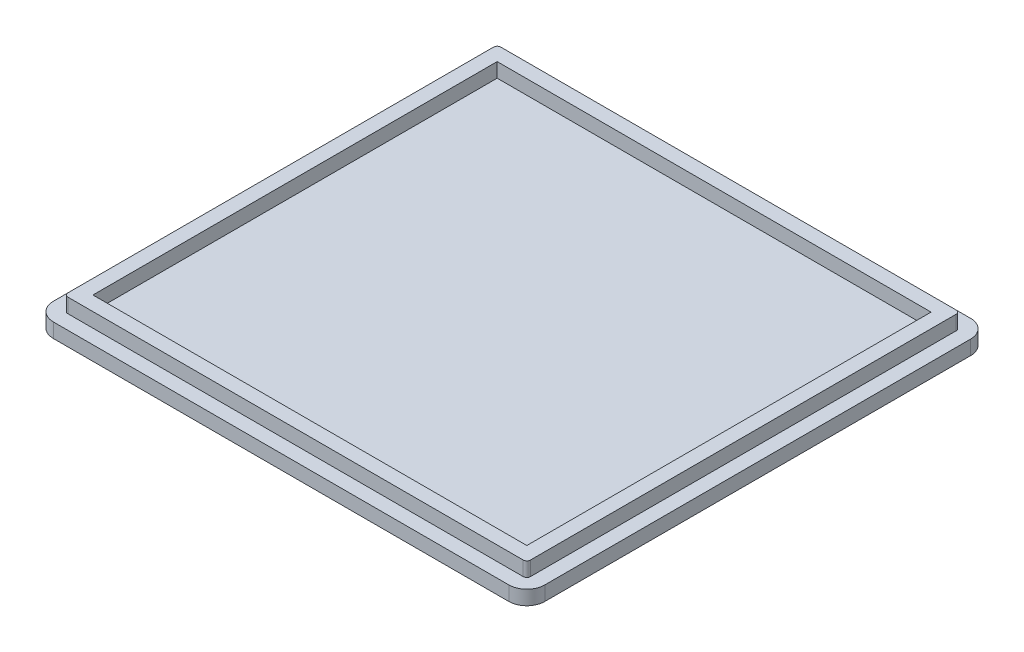
ISO-10303-21;
HEADER;
FILE_DESCRIPTION(('STEP AP214'),'2;1');
FILE_NAME('part.step','',(''),(''),'','','');
FILE_SCHEMA(('AUTOMOTIVE_DESIGN { 1 0 10303 214 1 1 1 1 }'));
ENDSEC;
DATA;
#1=APPLICATION_CONTEXT('core data for automotive mechanical design processes');
#2=APPLICATION_PROTOCOL_DEFINITION('international standard','automotive_design',2000,#1);
#3=PRODUCT_CONTEXT('',#1,'mechanical');
#4=PRODUCT('Part','Part','',(#3));
#5=PRODUCT_RELATED_PRODUCT_CATEGORY('part','',(#4));
#6=PRODUCT_DEFINITION_FORMATION('','',#4);
#7=PRODUCT_DEFINITION_CONTEXT('part definition',#1,'design');
#8=PRODUCT_DEFINITION('design','',#6,#7);
#9=PRODUCT_DEFINITION_SHAPE('','',#8);
#10=(LENGTH_UNIT() NAMED_UNIT(*) SI_UNIT(.MILLI.,.METRE.));
#11=(NAMED_UNIT(*) PLANE_ANGLE_UNIT() SI_UNIT($,.RADIAN.));
#12=(NAMED_UNIT(*) SI_UNIT($,.STERADIAN.) SOLID_ANGLE_UNIT());
#13=UNCERTAINTY_MEASURE_WITH_UNIT(LENGTH_MEASURE(1.E-05),#10,'distance_accuracy_value','');
#14=(GEOMETRIC_REPRESENTATION_CONTEXT(3) GLOBAL_UNCERTAINTY_ASSIGNED_CONTEXT((#13)) GLOBAL_UNIT_ASSIGNED_CONTEXT((#10,
#11,#12)) REPRESENTATION_CONTEXT('',''));
#15=CARTESIAN_POINT('',(0.,0.,0.));
#16=DIRECTION('',(0.,0.,1.));
#17=DIRECTION('',(1.,0.,0.));
#18=AXIS2_PLACEMENT_3D('',#15,#16,#17);
#19=CARTESIAN_POINT('',(0.,1.6,0.));
#20=DIRECTION('',(0.,1.,0.));
#21=DIRECTION('',(0.,0.,1.));
#22=AXIS2_PLACEMENT_3D('',#19,#20,#21);
#23=PLANE('',#22);
#24=DIRECTION('',(0.,0.,1.));
#25=VECTOR('',#24,1.);
#26=CARTESIAN_POINT('',(-25.75,1.6,0.));
#27=LINE('',#26,#25);
#28=CARTESIAN_POINT('',(-25.75,1.6,-23.7));
#29=VERTEX_POINT('',#28);
#30=CARTESIAN_POINT('',(-25.75,1.6,23.7));
#31=VERTEX_POINT('',#30);
#32=EDGE_CURVE('E234',#29,#31,#27,.T.);
#33=ORIENTED_EDGE('',*,*,#32,.F.);
#34=CARTESIAN_POINT('',(-25.35,1.6,-23.7));
#35=DIRECTION('',(0.,1.,0.));
#36=DIRECTION('',(0.,0.,1.));
#37=AXIS2_PLACEMENT_3D('',#34,#35,#36);
#38=CIRCLE('',#37,0.4);
#39=CARTESIAN_POINT('',(-25.35,1.6,-24.1));
#40=VERTEX_POINT('',#39);
#41=EDGE_CURVE('E11',#29,#40,#38,.F.);
#42=ORIENTED_EDGE('',*,*,#41,.T.);
#43=DIRECTION('',(-1.,0.,0.));
#44=VECTOR('',#43,1.);
#45=CARTESIAN_POINT('',(0.,1.6,-24.1));
#46=LINE('',#45,#44);
#47=CARTESIAN_POINT('',(25.35,1.6,-24.1));
#48=VERTEX_POINT('',#47);
#49=EDGE_CURVE('E223',#48,#40,#46,.T.);
#50=ORIENTED_EDGE('',*,*,#49,.F.);
#51=CARTESIAN_POINT('',(25.35,1.6,-23.7));
#52=DIRECTION('',(0.,1.,0.));
#53=DIRECTION('',(0.,0.,1.));
#54=AXIS2_PLACEMENT_3D('',#51,#52,#53);
#55=CIRCLE('',#54,0.4);
#56=CARTESIAN_POINT('',(25.75,1.6,-23.7));
#57=VERTEX_POINT('',#56);
#58=EDGE_CURVE('E369',#48,#57,#55,.F.);
#59=ORIENTED_EDGE('',*,*,#58,.T.);
#60=DIRECTION('',(0.,0.,1.));
#61=VECTOR('',#60,1.);
#62=CARTESIAN_POINT('',(25.75,1.6,0.));
#63=LINE('',#62,#61);
#64=CARTESIAN_POINT('',(25.75,1.6,23.7));
#65=VERTEX_POINT('',#64);
#66=EDGE_CURVE('E227',#57,#65,#63,.T.);
#67=ORIENTED_EDGE('',*,*,#66,.T.);
#68=CARTESIAN_POINT('',(25.35,1.6,23.7));
#69=DIRECTION('',(0.,1.,0.));
#70=DIRECTION('',(0.,0.,1.));
#71=AXIS2_PLACEMENT_3D('',#68,#69,#70);
#72=CIRCLE('',#71,0.4);
#73=CARTESIAN_POINT('',(25.35,1.6,24.1));
#74=VERTEX_POINT('',#73);
#75=EDGE_CURVE('E372',#65,#74,#72,.F.);
#76=ORIENTED_EDGE('',*,*,#75,.T.);
#77=DIRECTION('',(-1.,0.,0.));
#78=VECTOR('',#77,1.);
#79=CARTESIAN_POINT('',(0.,1.6,24.1));
#80=LINE('',#79,#78);
#81=CARTESIAN_POINT('',(-25.35,1.6,24.1));
#82=VERTEX_POINT('',#81);
#83=EDGE_CURVE('E231',#74,#82,#80,.T.);
#84=ORIENTED_EDGE('',*,*,#83,.T.);
#85=CARTESIAN_POINT('',(-25.35,1.6,23.7));
#86=DIRECTION('',(0.,1.,0.));
#87=DIRECTION('',(0.,0.,1.));
#88=AXIS2_PLACEMENT_3D('',#85,#86,#87);
#89=CIRCLE('',#88,0.4);
#90=EDGE_CURVE('E48',#82,#31,#89,.F.);
#91=ORIENTED_EDGE('',*,*,#90,.T.);
#92=EDGE_LOOP('',(#33,#42,#50,#59,#67,#76,#84,#91));
#93=FACE_BOUND('',#92,.T.);
#94=DIRECTION('',(0.,0.,-1.));
#95=VECTOR('',#94,1.);
#96=CARTESIAN_POINT('',(-27.35,1.6,0.));
#97=LINE('',#96,#95);
#98=CARTESIAN_POINT('',(-27.35,1.6,23.7));
#99=VERTEX_POINT('',#98);
#100=CARTESIAN_POINT('',(-27.35,1.6,-23.7));
#101=VERTEX_POINT('',#100);
#102=EDGE_CURVE('E260',#99,#101,#97,.T.);
#103=ORIENTED_EDGE('',*,*,#102,.F.);
#104=CARTESIAN_POINT('',(-25.35,1.6,23.7));
#105=DIRECTION('',(0.,1.,0.));
#106=DIRECTION('',(0.,0.,1.));
#107=AXIS2_PLACEMENT_3D('',#104,#105,#106);
#108=CIRCLE('',#107,2.);
#109=CARTESIAN_POINT('',(-25.35,1.6,25.7));
#110=VERTEX_POINT('',#109);
#111=EDGE_CURVE('E313',#99,#110,#108,.T.);
#112=ORIENTED_EDGE('',*,*,#111,.T.);
#113=DIRECTION('',(1.,0.,0.));
#114=VECTOR('',#113,1.);
#115=CARTESIAN_POINT('',(0.,1.6,25.7));
#116=LINE('',#115,#114);
#117=CARTESIAN_POINT('',(25.35,1.6,25.7));
#118=VERTEX_POINT('',#117);
#119=EDGE_CURVE('E247',#110,#118,#116,.T.);
#120=ORIENTED_EDGE('',*,*,#119,.T.);
#121=CARTESIAN_POINT('',(25.35,1.6,23.7));
#122=DIRECTION('',(0.,1.,0.));
#123=DIRECTION('',(0.,0.,1.));
#124=AXIS2_PLACEMENT_3D('',#121,#122,#123);
#125=CIRCLE('',#124,2.);
#126=CARTESIAN_POINT('',(27.35,1.6,23.7));
#127=VERTEX_POINT('',#126);
#128=EDGE_CURVE('E310',#118,#127,#125,.T.);
#129=ORIENTED_EDGE('',*,*,#128,.T.);
#130=DIRECTION('',(0.,0.,-1.));
#131=VECTOR('',#130,1.);
#132=CARTESIAN_POINT('',(27.35,1.6,0.));
#133=LINE('',#132,#131);
#134=CARTESIAN_POINT('',(27.35,1.6,-23.7));
#135=VERTEX_POINT('',#134);
#136=EDGE_CURVE('E251',#127,#135,#133,.T.);
#137=ORIENTED_EDGE('',*,*,#136,.T.);
#138=CARTESIAN_POINT('',(25.35,1.6,-23.7));
#139=DIRECTION('',(0.,1.,0.));
#140=DIRECTION('',(0.,0.,1.));
#141=AXIS2_PLACEMENT_3D('',#138,#139,#140);
#142=CIRCLE('',#141,2.);
#143=CARTESIAN_POINT('',(25.35,1.6,-25.7));
#144=VERTEX_POINT('',#143);
#145=EDGE_CURVE('E304',#135,#144,#142,.T.);
#146=ORIENTED_EDGE('',*,*,#145,.T.);
#147=DIRECTION('',(1.,0.,0.));
#148=VECTOR('',#147,1.);
#149=CARTESIAN_POINT('',(0.,1.6,-25.7));
#150=LINE('',#149,#148);
#151=CARTESIAN_POINT('',(-25.35,1.6,-25.7));
#152=VERTEX_POINT('',#151);
#153=EDGE_CURVE('E256',#152,#144,#150,.T.);
#154=ORIENTED_EDGE('',*,*,#153,.F.);
#155=CARTESIAN_POINT('',(-25.35,1.6,-23.7));
#156=DIRECTION('',(0.,1.,0.));
#157=DIRECTION('',(0.,0.,1.));
#158=AXIS2_PLACEMENT_3D('',#155,#156,#157);
#159=CIRCLE('',#158,2.);
#160=EDGE_CURVE('E307',#152,#101,#159,.T.);
#161=ORIENTED_EDGE('',*,*,#160,.T.);
#162=EDGE_LOOP('',(#103,#112,#120,#129,#137,#146,#154,#161));
#163=FACE_BOUND('',#162,.T.);
#164=ADVANCED_FACE('F39',(#93,#163),#23,.T.);
#165=CARTESIAN_POINT('',(0.,1.6,25.7));
#166=DIRECTION('',(0.,0.,-1.));
#167=DIRECTION('',(-1.,0.,0.));
#168=AXIS2_PLACEMENT_3D('',#165,#166,#167);
#169=PLANE('',#168);
#170=ORIENTED_EDGE('',*,*,#119,.F.);
#171=DIRECTION('',(0.,-1.,0.));
#172=VECTOR('',#171,1.);
#173=CARTESIAN_POINT('',(-25.35,0.,25.7));
#174=LINE('',#173,#172);
#175=CARTESIAN_POINT('',(-25.35,0.,25.7));
#176=VERTEX_POINT('',#175);
#177=EDGE_CURVE('E281',#110,#176,#174,.T.);
#178=ORIENTED_EDGE('',*,*,#177,.T.);
#179=DIRECTION('',(1.,0.,0.));
#180=VECTOR('',#179,1.);
#181=CARTESIAN_POINT('',(0.,0.,25.7));
#182=LINE('',#181,#180);
#183=CARTESIAN_POINT('',(25.35,0.,25.7));
#184=VERTEX_POINT('',#183);
#185=EDGE_CURVE('E246',#176,#184,#182,.T.);
#186=ORIENTED_EDGE('',*,*,#185,.T.);
#187=DIRECTION('',(0.,-1.,0.));
#188=VECTOR('',#187,1.);
#189=CARTESIAN_POINT('',(25.35,1.6,25.7));
#190=LINE('',#189,#188);
#191=EDGE_CURVE('E264',#184,#118,#190,.F.);
#192=ORIENTED_EDGE('',*,*,#191,.T.);
#193=EDGE_LOOP('',(#170,#178,#186,#192));
#194=FACE_BOUND('',#193,.T.);
#195=ADVANCED_FACE('F429',(#194),#169,.F.);
#196=CARTESIAN_POINT('',(27.35,1.6,0.));
#197=DIRECTION('',(-1.,0.,0.));
#198=DIRECTION('',(0.,0.,1.));
#199=AXIS2_PLACEMENT_3D('',#196,#197,#198);
#200=PLANE('',#199);
#201=ORIENTED_EDGE('',*,*,#136,.F.);
#202=DIRECTION('',(0.,-1.,0.));
#203=VECTOR('',#202,1.);
#204=CARTESIAN_POINT('',(27.35,1.6,23.7));
#205=LINE('',#204,#203);
#206=CARTESIAN_POINT('',(27.35,0.,23.7));
#207=VERTEX_POINT('',#206);
#208=EDGE_CURVE('E319',#127,#207,#205,.T.);
#209=ORIENTED_EDGE('',*,*,#208,.T.);
#210=DIRECTION('',(0.,0.,-1.));
#211=VECTOR('',#210,1.);
#212=CARTESIAN_POINT('',(27.35,0.,0.));
#213=LINE('',#212,#211);
#214=CARTESIAN_POINT('',(27.35,0.,-23.7));
#215=VERTEX_POINT('',#214);
#216=EDGE_CURVE('E268',#207,#215,#213,.T.);
#217=ORIENTED_EDGE('',*,*,#216,.T.);
#218=DIRECTION('',(0.,-1.,0.));
#219=VECTOR('',#218,1.);
#220=CARTESIAN_POINT('',(27.35,1.6,-23.7));
#221=LINE('',#220,#219);
#222=EDGE_CURVE('E316',#215,#135,#221,.F.);
#223=ORIENTED_EDGE('',*,*,#222,.T.);
#224=EDGE_LOOP('',(#201,#209,#217,#223));
#225=FACE_BOUND('',#224,.T.);
#226=ADVANCED_FACE('F435',(#225),#200,.F.);
#227=CARTESIAN_POINT('',(0.,1.6,-25.7));
#228=DIRECTION('',(0.,0.,-1.));
#229=DIRECTION('',(-1.,0.,0.));
#230=AXIS2_PLACEMENT_3D('',#227,#228,#229);
#231=PLANE('',#230);
#232=DIRECTION('',(1.,0.,0.));
#233=VECTOR('',#232,1.);
#234=CARTESIAN_POINT('',(0.,0.,-25.7));
#235=LINE('',#234,#233);
#236=CARTESIAN_POINT('',(-25.35,0.,-25.7));
#237=VERTEX_POINT('',#236);
#238=CARTESIAN_POINT('',(25.35,0.,-25.7));
#239=VERTEX_POINT('',#238);
#240=EDGE_CURVE('E272',#237,#239,#235,.T.);
#241=ORIENTED_EDGE('',*,*,#240,.F.);
#242=DIRECTION('',(0.,-1.,0.));
#243=VECTOR('',#242,1.);
#244=CARTESIAN_POINT('',(-25.35,1.6,-25.7));
#245=LINE('',#244,#243);
#246=EDGE_CURVE('E327',#237,#152,#245,.F.);
#247=ORIENTED_EDGE('',*,*,#246,.T.);
#248=ORIENTED_EDGE('',*,*,#153,.T.);
#249=DIRECTION('',(0.,-1.,0.));
#250=VECTOR('',#249,1.);
#251=CARTESIAN_POINT('',(25.35,0.,-25.7));
#252=LINE('',#251,#250);
#253=EDGE_CURVE('E323',#144,#239,#252,.T.);
#254=ORIENTED_EDGE('',*,*,#253,.T.);
#255=EDGE_LOOP('',(#241,#247,#248,#254));
#256=FACE_BOUND('',#255,.T.);
#257=ADVANCED_FACE('F571',(#256),#231,.T.);
#258=CARTESIAN_POINT('',(-27.35,1.6,0.));
#259=DIRECTION('',(-1.,0.,0.));
#260=DIRECTION('',(0.,0.,1.));
#261=AXIS2_PLACEMENT_3D('',#258,#259,#260);
#262=PLANE('',#261);
#263=DIRECTION('',(0.,0.,-1.));
#264=VECTOR('',#263,1.);
#265=CARTESIAN_POINT('',(-27.35,0.,0.));
#266=LINE('',#265,#264);
#267=CARTESIAN_POINT('',(-27.35,0.,23.7));
#268=VERTEX_POINT('',#267);
#269=CARTESIAN_POINT('',(-27.35,0.,-23.7));
#270=VERTEX_POINT('',#269);
#271=EDGE_CURVE('E252',#268,#270,#266,.T.);
#272=ORIENTED_EDGE('',*,*,#271,.F.);
#273=DIRECTION('',(0.,-1.,0.));
#274=VECTOR('',#273,1.);
#275=CARTESIAN_POINT('',(-27.35,1.6,23.7));
#276=LINE('',#275,#274);
#277=EDGE_CURVE('E301',#268,#99,#276,.F.);
#278=ORIENTED_EDGE('',*,*,#277,.T.);
#279=ORIENTED_EDGE('',*,*,#102,.T.);
#280=DIRECTION('',(0.,-1.,0.));
#281=VECTOR('',#280,1.);
#282=CARTESIAN_POINT('',(-27.35,1.6,-23.7));
#283=LINE('',#282,#281);
#284=EDGE_CURVE('E297',#101,#270,#283,.T.);
#285=ORIENTED_EDGE('',*,*,#284,.T.);
#286=EDGE_LOOP('',(#272,#278,#279,#285));
#287=FACE_BOUND('',#286,.T.);
#288=ADVANCED_FACE('F560',(#287),#262,.T.);
#289=CARTESIAN_POINT('',(0.,0.,0.));
#290=DIRECTION('',(0.,1.,0.));
#291=DIRECTION('',(0.,0.,1.));
#292=AXIS2_PLACEMENT_3D('',#289,#290,#291);
#293=PLANE('',#292);
#294=ORIENTED_EDGE('',*,*,#185,.F.);
#295=CARTESIAN_POINT('',(-25.35,0.,23.7));
#296=DIRECTION('',(0.,1.,0.));
#297=DIRECTION('',(0.,0.,1.));
#298=AXIS2_PLACEMENT_3D('',#295,#296,#297);
#299=CIRCLE('',#298,2.);
#300=EDGE_CURVE('E294',#176,#268,#299,.F.);
#301=ORIENTED_EDGE('',*,*,#300,.T.);
#302=ORIENTED_EDGE('',*,*,#271,.T.);
#303=CARTESIAN_POINT('',(-25.35,0.,-23.7));
#304=DIRECTION('',(0.,1.,0.));
#305=DIRECTION('',(0.,0.,1.));
#306=AXIS2_PLACEMENT_3D('',#303,#304,#305);
#307=CIRCLE('',#306,2.);
#308=EDGE_CURVE('E288',#270,#237,#307,.F.);
#309=ORIENTED_EDGE('',*,*,#308,.T.);
#310=ORIENTED_EDGE('',*,*,#240,.T.);
#311=CARTESIAN_POINT('',(25.35,0.,-23.7));
#312=DIRECTION('',(0.,1.,0.));
#313=DIRECTION('',(0.,0.,1.));
#314=AXIS2_PLACEMENT_3D('',#311,#312,#313);
#315=CIRCLE('',#314,2.);
#316=EDGE_CURVE('E285',#239,#215,#315,.F.);
#317=ORIENTED_EDGE('',*,*,#316,.T.);
#318=ORIENTED_EDGE('',*,*,#216,.F.);
#319=CARTESIAN_POINT('',(25.35,0.,23.7));
#320=DIRECTION('',(0.,1.,0.));
#321=DIRECTION('',(0.,0.,1.));
#322=AXIS2_PLACEMENT_3D('',#319,#320,#321);
#323=CIRCLE('',#322,2.);
#324=EDGE_CURVE('E291',#207,#184,#323,.F.);
#325=ORIENTED_EDGE('',*,*,#324,.T.);
#326=EDGE_LOOP('',(#294,#301,#302,#309,#310,#317,#318,#325));
#327=FACE_BOUND('',#326,.T.);
#328=ADVANCED_FACE('F469',(#327),#293,.F.);
#329=CARTESIAN_POINT('',(24.15,3.2,0.));
#330=DIRECTION('',(-1.,0.,0.));
#331=DIRECTION('',(0.,0.,1.));
#332=AXIS2_PLACEMENT_3D('',#329,#330,#331);
#333=PLANE('',#332);
#334=DIRECTION('',(0.,-1.,0.));
#335=VECTOR('',#334,1.);
#336=CARTESIAN_POINT('',(24.15,3.2,-22.5));
#337=LINE('',#336,#335);
#338=CARTESIAN_POINT('',(24.15,3.2,-22.5));
#339=VERTEX_POINT('',#338);
#340=CARTESIAN_POINT('',(24.15,1.6,-22.5));
#341=VERTEX_POINT('',#340);
#342=EDGE_CURVE('E212',#339,#341,#337,.T.);
#343=ORIENTED_EDGE('',*,*,#342,.T.);
#344=DIRECTION('',(0.,0.,1.));
#345=VECTOR('',#344,1.);
#346=CARTESIAN_POINT('',(24.15,1.6,0.));
#347=LINE('',#346,#345);
#348=CARTESIAN_POINT('',(24.15,1.6,22.5));
#349=VERTEX_POINT('',#348);
#350=EDGE_CURVE('E182',#341,#349,#347,.T.);
#351=ORIENTED_EDGE('',*,*,#350,.T.);
#352=DIRECTION('',(0.,-1.,0.));
#353=VECTOR('',#352,1.);
#354=CARTESIAN_POINT('',(24.15,3.2,22.5));
#355=LINE('',#354,#353);
#356=CARTESIAN_POINT('',(24.15,3.2,22.5));
#357=VERTEX_POINT('',#356);
#358=EDGE_CURVE('E176',#357,#349,#355,.T.);
#359=ORIENTED_EDGE('',*,*,#358,.F.);
#360=DIRECTION('',(0.,0.,-1.));
#361=VECTOR('',#360,1.);
#362=CARTESIAN_POINT('',(24.15,3.2,0.));
#363=LINE('',#362,#361);
#364=EDGE_CURVE('E180',#357,#339,#363,.T.);
#365=ORIENTED_EDGE('',*,*,#364,.T.);
#366=EDGE_LOOP('',(#343,#351,#359,#365));
#367=FACE_BOUND('',#366,.T.);
#368=ADVANCED_FACE('F179',(#367),#333,.T.);
#369=CARTESIAN_POINT('',(0.,3.2,22.5));
#370=DIRECTION('',(0.,0.,-1.));
#371=DIRECTION('',(-1.,0.,0.));
#372=AXIS2_PLACEMENT_3D('',#369,#370,#371);
#373=PLANE('',#372);
#374=ORIENTED_EDGE('',*,*,#358,.T.);
#375=DIRECTION('',(-1.,0.,0.));
#376=VECTOR('',#375,1.);
#377=CARTESIAN_POINT('',(0.,1.6,22.5));
#378=LINE('',#377,#376);
#379=CARTESIAN_POINT('',(-24.15,1.6,22.5));
#380=VERTEX_POINT('',#379);
#381=EDGE_CURVE('E241',#349,#380,#378,.T.);
#382=ORIENTED_EDGE('',*,*,#381,.T.);
#383=DIRECTION('',(0.,-1.,0.));
#384=VECTOR('',#383,1.);
#385=CARTESIAN_POINT('',(-24.15,3.2,22.5));
#386=LINE('',#385,#384);
#387=CARTESIAN_POINT('',(-24.15,3.2,22.5));
#388=VERTEX_POINT('',#387);
#389=EDGE_CURVE('E188',#388,#380,#386,.T.);
#390=ORIENTED_EDGE('',*,*,#389,.F.);
#391=DIRECTION('',(1.,0.,0.));
#392=VECTOR('',#391,1.);
#393=CARTESIAN_POINT('',(0.,3.2,22.5));
#394=LINE('',#393,#392);
#395=EDGE_CURVE('E194',#388,#357,#394,.T.);
#396=ORIENTED_EDGE('',*,*,#395,.T.);
#397=EDGE_LOOP('',(#374,#382,#390,#396));
#398=FACE_BOUND('',#397,.T.);
#399=ADVANCED_FACE('F200',(#398),#373,.T.);
#400=CARTESIAN_POINT('',(-24.15,3.2,0.));
#401=DIRECTION('',(-1.,0.,0.));
#402=DIRECTION('',(0.,0.,1.));
#403=AXIS2_PLACEMENT_3D('',#400,#401,#402);
#404=PLANE('',#403);
#405=DIRECTION('',(0.,0.,1.));
#406=VECTOR('',#405,1.);
#407=CARTESIAN_POINT('',(-24.15,1.6,0.));
#408=LINE('',#407,#406);
#409=CARTESIAN_POINT('',(-24.15,1.6,-22.5));
#410=VERTEX_POINT('',#409);
#411=EDGE_CURVE('E237',#410,#380,#408,.T.);
#412=ORIENTED_EDGE('',*,*,#411,.F.);
#413=DIRECTION('',(0.,-1.,0.));
#414=VECTOR('',#413,1.);
#415=CARTESIAN_POINT('',(-24.15,3.2,-22.5));
#416=LINE('',#415,#414);
#417=CARTESIAN_POINT('',(-24.15,3.2,-22.5));
#418=VERTEX_POINT('',#417);
#419=EDGE_CURVE('E215',#418,#410,#416,.T.);
#420=ORIENTED_EDGE('',*,*,#419,.F.);
#421=DIRECTION('',(0.,0.,-1.));
#422=VECTOR('',#421,1.);
#423=CARTESIAN_POINT('',(-24.15,3.2,0.));
#424=LINE('',#423,#422);
#425=EDGE_CURVE('E204',#388,#418,#424,.T.);
#426=ORIENTED_EDGE('',*,*,#425,.F.);
#427=ORIENTED_EDGE('',*,*,#389,.T.);
#428=EDGE_LOOP('',(#412,#420,#426,#427));
#429=FACE_BOUND('',#428,.T.);
#430=ADVANCED_FACE('F454',(#429),#404,.F.);
#431=CARTESIAN_POINT('',(-25.75,3.2,0.));
#432=DIRECTION('',(-1.,0.,0.));
#433=DIRECTION('',(0.,0.,1.));
#434=AXIS2_PLACEMENT_3D('',#431,#432,#433);
#435=PLANE('',#434);
#436=ORIENTED_EDGE('',*,*,#32,.T.);
#437=DIRECTION('',(0.,-1.,0.));
#438=VECTOR('',#437,1.);
#439=CARTESIAN_POINT('',(-25.75,3.2,23.7));
#440=LINE('',#439,#438);
#441=CARTESIAN_POINT('',(-25.75,3.2,23.7));
#442=VERTEX_POINT('',#441);
#443=EDGE_CURVE('E366',#31,#442,#440,.F.);
#444=ORIENTED_EDGE('',*,*,#443,.T.);
#445=DIRECTION('',(0.,0.,-1.));
#446=VECTOR('',#445,1.);
#447=CARTESIAN_POINT('',(-25.75,3.2,0.));
#448=LINE('',#447,#446);
#449=CARTESIAN_POINT('',(-25.75,3.2,-23.7));
#450=VERTEX_POINT('',#449);
#451=EDGE_CURVE('E402',#442,#450,#448,.T.);
#452=ORIENTED_EDGE('',*,*,#451,.T.);
#453=DIRECTION('',(0.,-1.,0.));
#454=VECTOR('',#453,1.);
#455=CARTESIAN_POINT('',(-25.75,3.2,-23.7));
#456=LINE('',#455,#454);
#457=EDGE_CURVE('E363',#450,#29,#456,.T.);
#458=ORIENTED_EDGE('',*,*,#457,.T.);
#459=EDGE_LOOP('',(#436,#444,#452,#458));
#460=FACE_BOUND('',#459,.T.);
#461=ADVANCED_FACE('F409',(#460),#435,.T.);
#462=CARTESIAN_POINT('',(0.,3.2,24.1));
#463=DIRECTION('',(0.,0.,-1.));
#464=DIRECTION('',(-1.,0.,0.));
#465=AXIS2_PLACEMENT_3D('',#462,#463,#464);
#466=PLANE('',#465);
#467=ORIENTED_EDGE('',*,*,#83,.F.);
#468=DIRECTION('',(0.,-1.,0.));
#469=VECTOR('',#468,1.);
#470=CARTESIAN_POINT('',(25.35,3.2,24.1));
#471=LINE('',#470,#469);
#472=CARTESIAN_POINT('',(25.35,3.2,24.1));
#473=VERTEX_POINT('',#472);
#474=EDGE_CURVE('E360',#74,#473,#471,.F.);
#475=ORIENTED_EDGE('',*,*,#474,.T.);
#476=DIRECTION('',(1.,0.,0.));
#477=VECTOR('',#476,1.);
#478=CARTESIAN_POINT('',(0.,3.2,24.1));
#479=LINE('',#478,#477);
#480=CARTESIAN_POINT('',(-25.35,3.2,24.1));
#481=VERTEX_POINT('',#480);
#482=EDGE_CURVE('E393',#481,#473,#479,.T.);
#483=ORIENTED_EDGE('',*,*,#482,.F.);
#484=DIRECTION('',(0.,-1.,0.));
#485=VECTOR('',#484,1.);
#486=CARTESIAN_POINT('',(-25.35,1.6,24.1));
#487=LINE('',#486,#485);
#488=EDGE_CURVE('E356',#481,#82,#487,.T.);
#489=ORIENTED_EDGE('',*,*,#488,.T.);
#490=EDGE_LOOP('',(#467,#475,#483,#489));
#491=FACE_BOUND('',#490,.T.);
#492=ADVANCED_FACE('F382',(#491),#466,.F.);
#493=CARTESIAN_POINT('',(25.75,3.2,0.));
#494=DIRECTION('',(-1.,0.,0.));
#495=DIRECTION('',(0.,0.,1.));
#496=AXIS2_PLACEMENT_3D('',#493,#494,#495);
#497=PLANE('',#496);
#498=ORIENTED_EDGE('',*,*,#66,.F.);
#499=DIRECTION('',(0.,-1.,0.));
#500=VECTOR('',#499,1.);
#501=CARTESIAN_POINT('',(25.75,3.2,-23.7));
#502=LINE('',#501,#500);
#503=CARTESIAN_POINT('',(25.75,3.2,-23.7));
#504=VERTEX_POINT('',#503);
#505=EDGE_CURVE('E341',#57,#504,#502,.F.);
#506=ORIENTED_EDGE('',*,*,#505,.T.);
#507=DIRECTION('',(0.,0.,-1.));
#508=VECTOR('',#507,1.);
#509=CARTESIAN_POINT('',(25.75,3.2,0.));
#510=LINE('',#509,#508);
#511=CARTESIAN_POINT('',(25.75,3.2,23.7));
#512=VERTEX_POINT('',#511);
#513=EDGE_CURVE('E391',#512,#504,#510,.T.);
#514=ORIENTED_EDGE('',*,*,#513,.F.);
#515=DIRECTION('',(0.,-1.,0.));
#516=VECTOR('',#515,1.);
#517=CARTESIAN_POINT('',(25.75,3.2,23.7));
#518=LINE('',#517,#516);
#519=EDGE_CURVE('E337',#512,#65,#518,.T.);
#520=ORIENTED_EDGE('',*,*,#519,.T.);
#521=EDGE_LOOP('',(#498,#506,#514,#520));
#522=FACE_BOUND('',#521,.T.);
#523=ADVANCED_FACE('F395',(#522),#497,.F.);
#524=CARTESIAN_POINT('',(0.,3.2,-24.1));
#525=DIRECTION('',(0.,0.,-1.));
#526=DIRECTION('',(-1.,0.,0.));
#527=AXIS2_PLACEMENT_3D('',#524,#525,#526);
#528=PLANE('',#527);
#529=DIRECTION('',(1.,0.,0.));
#530=VECTOR('',#529,1.);
#531=CARTESIAN_POINT('',(0.,3.2,-24.1));
#532=LINE('',#531,#530);
#533=CARTESIAN_POINT('',(-25.35,3.2,-24.1));
#534=VERTEX_POINT('',#533);
#535=CARTESIAN_POINT('',(25.35,3.2,-24.1));
#536=VERTEX_POINT('',#535);
#537=EDGE_CURVE('E198',#534,#536,#532,.T.);
#538=ORIENTED_EDGE('',*,*,#537,.T.);
#539=DIRECTION('',(0.,-1.,0.));
#540=VECTOR('',#539,1.);
#541=CARTESIAN_POINT('',(25.35,1.6,-24.1));
#542=LINE('',#541,#540);
#543=EDGE_CURVE('E333',#536,#48,#542,.T.);
#544=ORIENTED_EDGE('',*,*,#543,.T.);
#545=ORIENTED_EDGE('',*,*,#49,.T.);
#546=DIRECTION('',(0.,-1.,0.));
#547=VECTOR('',#546,1.);
#548=CARTESIAN_POINT('',(-25.35,3.2,-24.1));
#549=LINE('',#548,#547);
#550=EDGE_CURVE('E330',#40,#534,#549,.F.);
#551=ORIENTED_EDGE('',*,*,#550,.T.);
#552=EDGE_LOOP('',(#538,#544,#545,#551));
#553=FACE_BOUND('',#552,.T.);
#554=ADVANCED_FACE('F416',(#553),#528,.T.);
#555=CARTESIAN_POINT('',(0.,3.2,-22.5));
#556=DIRECTION('',(0.,0.,-1.));
#557=DIRECTION('',(-1.,0.,0.));
#558=AXIS2_PLACEMENT_3D('',#555,#556,#557);
#559=PLANE('',#558);
#560=DIRECTION('',(-1.,0.,0.));
#561=VECTOR('',#560,1.);
#562=CARTESIAN_POINT('',(0.,1.6,-22.5));
#563=LINE('',#562,#561);
#564=EDGE_CURVE('E187',#341,#410,#563,.T.);
#565=ORIENTED_EDGE('',*,*,#564,.F.);
#566=ORIENTED_EDGE('',*,*,#342,.F.);
#567=DIRECTION('',(1.,0.,0.));
#568=VECTOR('',#567,1.);
#569=CARTESIAN_POINT('',(0.,3.2,-22.5));
#570=LINE('',#569,#568);
#571=EDGE_CURVE('E195',#418,#339,#570,.T.);
#572=ORIENTED_EDGE('',*,*,#571,.F.);
#573=ORIENTED_EDGE('',*,*,#419,.T.);
#574=EDGE_LOOP('',(#565,#566,#572,#573));
#575=FACE_BOUND('',#574,.T.);
#576=ADVANCED_FACE('F450',(#575),#559,.F.);
#577=CARTESIAN_POINT('',(0.,3.2,0.));
#578=DIRECTION('',(0.,1.,0.));
#579=DIRECTION('',(0.,0.,1.));
#580=AXIS2_PLACEMENT_3D('',#577,#578,#579);
#581=PLANE('',#580);
#582=ORIENTED_EDGE('',*,*,#513,.T.);
#583=CARTESIAN_POINT('',(25.35,3.2,-23.7));
#584=DIRECTION('',(0.,1.,0.));
#585=DIRECTION('',(0.,0.,1.));
#586=AXIS2_PLACEMENT_3D('',#583,#584,#585);
#587=CIRCLE('',#586,0.4);
#588=EDGE_CURVE('E353',#504,#536,#587,.T.);
#589=ORIENTED_EDGE('',*,*,#588,.T.);
#590=ORIENTED_EDGE('',*,*,#537,.F.);
#591=CARTESIAN_POINT('',(-25.35,3.2,-23.7));
#592=DIRECTION('',(0.,1.,0.));
#593=DIRECTION('',(0.,0.,1.));
#594=AXIS2_PLACEMENT_3D('',#591,#592,#593);
#595=CIRCLE('',#594,0.4);
#596=EDGE_CURVE('E344',#534,#450,#595,.T.);
#597=ORIENTED_EDGE('',*,*,#596,.T.);
#598=ORIENTED_EDGE('',*,*,#451,.F.);
#599=CARTESIAN_POINT('',(-25.35,3.2,23.7));
#600=DIRECTION('',(0.,1.,0.));
#601=DIRECTION('',(0.,0.,1.));
#602=AXIS2_PLACEMENT_3D('',#599,#600,#601);
#603=CIRCLE('',#602,0.4);
#604=EDGE_CURVE('E347',#442,#481,#603,.T.);
#605=ORIENTED_EDGE('',*,*,#604,.T.);
#606=ORIENTED_EDGE('',*,*,#482,.T.);
#607=CARTESIAN_POINT('',(25.35,3.2,23.7));
#608=DIRECTION('',(0.,1.,0.));
#609=DIRECTION('',(0.,0.,1.));
#610=AXIS2_PLACEMENT_3D('',#607,#608,#609);
#611=CIRCLE('',#610,0.4);
#612=EDGE_CURVE('E350',#473,#512,#611,.T.);
#613=ORIENTED_EDGE('',*,*,#612,.T.);
#614=EDGE_LOOP('',(#582,#589,#590,#597,#598,#605,#606,#613));
#615=FACE_BOUND('',#614,.T.);
#616=ORIENTED_EDGE('',*,*,#364,.F.);
#617=ORIENTED_EDGE('',*,*,#395,.F.);
#618=ORIENTED_EDGE('',*,*,#425,.T.);
#619=ORIENTED_EDGE('',*,*,#571,.T.);
#620=EDGE_LOOP('',(#616,#617,#618,#619));
#621=FACE_BOUND('',#620,.T.);
#622=ADVANCED_FACE('F192',(#615,#621),#581,.T.);
#623=ORIENTED_EDGE('',*,*,#350,.F.);
#624=ORIENTED_EDGE('',*,*,#564,.T.);
#625=ORIENTED_EDGE('',*,*,#411,.T.);
#626=ORIENTED_EDGE('',*,*,#381,.F.);
#627=EDGE_LOOP('',(#623,#624,#625,#626));
#628=FACE_BOUND('',#627,.T.);
#629=ADVANCED_FACE('F431',(#628),#23,.T.);
#630=CARTESIAN_POINT('',(-25.35,1.6,23.7));
#631=DIRECTION('',(0.,1.,0.));
#632=DIRECTION('',(0.,0.,1.));
#633=AXIS2_PLACEMENT_3D('',#630,#631,#632);
#634=CYLINDRICAL_SURFACE('',#633,2.);
#635=ORIENTED_EDGE('',*,*,#111,.F.);
#636=ORIENTED_EDGE('',*,*,#277,.F.);
#637=ORIENTED_EDGE('',*,*,#300,.F.);
#638=ORIENTED_EDGE('',*,*,#177,.F.);
#639=EDGE_LOOP('',(#635,#636,#637,#638));
#640=FACE_BOUND('',#639,.T.);
#641=ADVANCED_FACE('F441',(#640),#634,.T.);
#642=CARTESIAN_POINT('',(25.35,1.6,23.7));
#643=DIRECTION('',(0.,-1.,0.));
#644=DIRECTION('',(0.,0.,-1.));
#645=AXIS2_PLACEMENT_3D('',#642,#643,#644);
#646=CYLINDRICAL_SURFACE('',#645,2.);
#647=ORIENTED_EDGE('',*,*,#128,.F.);
#648=ORIENTED_EDGE('',*,*,#191,.F.);
#649=ORIENTED_EDGE('',*,*,#324,.F.);
#650=ORIENTED_EDGE('',*,*,#208,.F.);
#651=EDGE_LOOP('',(#647,#648,#649,#650));
#652=FACE_BOUND('',#651,.T.);
#653=ADVANCED_FACE('F447',(#652),#646,.T.);
#654=CARTESIAN_POINT('',(-25.35,1.6,-23.7));
#655=DIRECTION('',(0.,-1.,0.));
#656=DIRECTION('',(0.,0.,-1.));
#657=AXIS2_PLACEMENT_3D('',#654,#655,#656);
#658=CYLINDRICAL_SURFACE('',#657,2.);
#659=ORIENTED_EDGE('',*,*,#160,.F.);
#660=ORIENTED_EDGE('',*,*,#246,.F.);
#661=ORIENTED_EDGE('',*,*,#308,.F.);
#662=ORIENTED_EDGE('',*,*,#284,.F.);
#663=EDGE_LOOP('',(#659,#660,#661,#662));
#664=FACE_BOUND('',#663,.T.);
#665=ADVANCED_FACE('F533',(#664),#658,.T.);
#666=CARTESIAN_POINT('',(25.35,1.6,-23.7));
#667=DIRECTION('',(0.,1.,0.));
#668=DIRECTION('',(0.,0.,1.));
#669=AXIS2_PLACEMENT_3D('',#666,#667,#668);
#670=CYLINDRICAL_SURFACE('',#669,2.);
#671=ORIENTED_EDGE('',*,*,#145,.F.);
#672=ORIENTED_EDGE('',*,*,#222,.F.);
#673=ORIENTED_EDGE('',*,*,#316,.F.);
#674=ORIENTED_EDGE('',*,*,#253,.F.);
#675=EDGE_LOOP('',(#671,#672,#673,#674));
#676=FACE_BOUND('',#675,.T.);
#677=ADVANCED_FACE('F508',(#676),#670,.T.);
#678=CARTESIAN_POINT('',(25.35,3.2,-23.7));
#679=DIRECTION('',(0.,1.,0.));
#680=DIRECTION('',(0.,0.,1.));
#681=AXIS2_PLACEMENT_3D('',#678,#679,#680);
#682=CYLINDRICAL_SURFACE('',#681,0.4);
#683=ORIENTED_EDGE('',*,*,#588,.F.);
#684=ORIENTED_EDGE('',*,*,#505,.F.);
#685=ORIENTED_EDGE('',*,*,#58,.F.);
#686=ORIENTED_EDGE('',*,*,#543,.F.);
#687=EDGE_LOOP('',(#683,#684,#685,#686));
#688=FACE_BOUND('',#687,.T.);
#689=ADVANCED_FACE('F419',(#688),#682,.T.);
#690=CARTESIAN_POINT('',(25.35,3.2,23.7));
#691=DIRECTION('',(0.,-1.,0.));
#692=DIRECTION('',(0.,0.,-1.));
#693=AXIS2_PLACEMENT_3D('',#690,#691,#692);
#694=CYLINDRICAL_SURFACE('',#693,0.4);
#695=ORIENTED_EDGE('',*,*,#612,.F.);
#696=ORIENTED_EDGE('',*,*,#474,.F.);
#697=ORIENTED_EDGE('',*,*,#75,.F.);
#698=ORIENTED_EDGE('',*,*,#519,.F.);
#699=EDGE_LOOP('',(#695,#696,#697,#698));
#700=FACE_BOUND('',#699,.T.);
#701=ADVANCED_FACE('F387',(#700),#694,.T.);
#702=CARTESIAN_POINT('',(-25.35,3.2,23.7));
#703=DIRECTION('',(0.,1.,0.));
#704=DIRECTION('',(0.,0.,1.));
#705=AXIS2_PLACEMENT_3D('',#702,#703,#704);
#706=CYLINDRICAL_SURFACE('',#705,0.4);
#707=ORIENTED_EDGE('',*,*,#604,.F.);
#708=ORIENTED_EDGE('',*,*,#443,.F.);
#709=ORIENTED_EDGE('',*,*,#90,.F.);
#710=ORIENTED_EDGE('',*,*,#488,.F.);
#711=EDGE_LOOP('',(#707,#708,#709,#710));
#712=FACE_BOUND('',#711,.T.);
#713=ADVANCED_FACE('F421',(#712),#706,.T.);
#714=CARTESIAN_POINT('',(-25.35,3.2,-23.7));
#715=DIRECTION('',(0.,-1.,0.));
#716=DIRECTION('',(0.,0.,-1.));
#717=AXIS2_PLACEMENT_3D('',#714,#715,#716);
#718=CYLINDRICAL_SURFACE('',#717,0.4);
#719=ORIENTED_EDGE('',*,*,#596,.F.);
#720=ORIENTED_EDGE('',*,*,#550,.F.);
#721=ORIENTED_EDGE('',*,*,#41,.F.);
#722=ORIENTED_EDGE('',*,*,#457,.F.);
#723=EDGE_LOOP('',(#719,#720,#721,#722));
#724=FACE_BOUND('',#723,.T.);
#725=ADVANCED_FACE('F41',(#724),#718,.T.);
#726=CLOSED_SHELL('',(#164,#195,#226,#257,#288,#328,#368,#399,#430,#461,#492,#523,#554,#576,
#622,#629,#641,#653,#665,#677,#689,#701,#713,#725));
#727=MANIFOLD_SOLID_BREP('B2',#726);
#728=ADVANCED_BREP_SHAPE_REPRESENTATION('',(#18,#727),#14);
#729=SHAPE_DEFINITION_REPRESENTATION(#9,#728);
ENDSEC;
END-ISO-10303-21;
